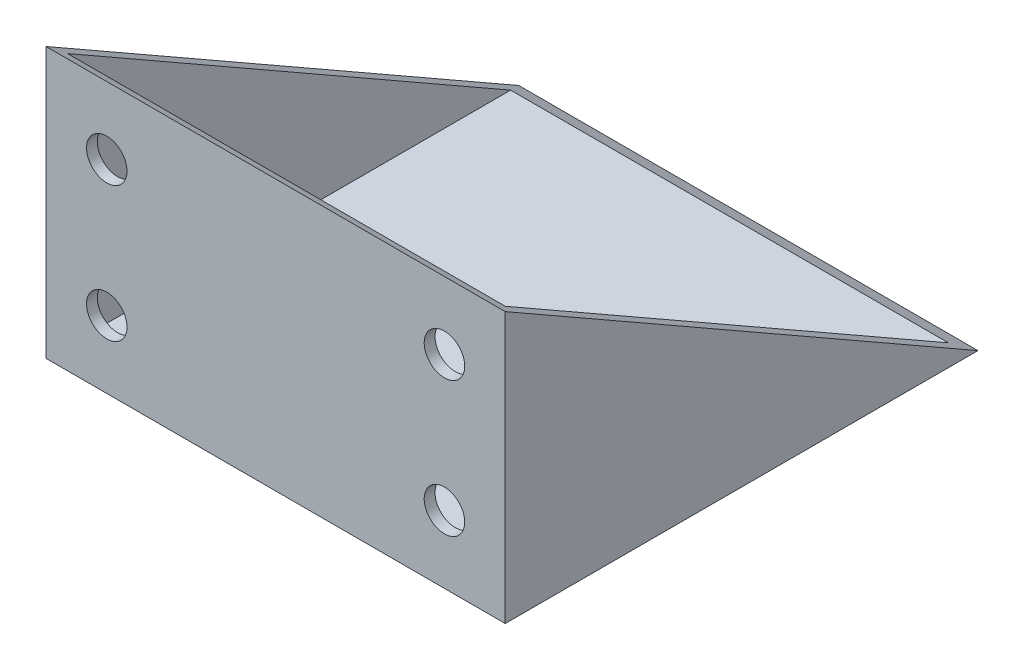
ISO-10303-21;
HEADER;
FILE_DESCRIPTION(('STEP AP214'),'2;1');
FILE_NAME('part.step','',(''),(''),'','','');
FILE_SCHEMA(('AUTOMOTIVE_DESIGN { 1 0 10303 214 1 1 1 1 }'));
ENDSEC;
DATA;
#1=APPLICATION_CONTEXT('core data for automotive mechanical design processes');
#2=APPLICATION_PROTOCOL_DEFINITION('international standard','automotive_design',2000,#1);
#3=PRODUCT_CONTEXT('',#1,'mechanical');
#4=PRODUCT('Part','Part','',(#3));
#5=PRODUCT_RELATED_PRODUCT_CATEGORY('part','',(#4));
#6=PRODUCT_DEFINITION_FORMATION('','',#4);
#7=PRODUCT_DEFINITION_CONTEXT('part definition',#1,'design');
#8=PRODUCT_DEFINITION('design','',#6,#7);
#9=PRODUCT_DEFINITION_SHAPE('','',#8);
#10=(LENGTH_UNIT() NAMED_UNIT(*) SI_UNIT(.MILLI.,.METRE.));
#11=(NAMED_UNIT(*) PLANE_ANGLE_UNIT() SI_UNIT($,.RADIAN.));
#12=(NAMED_UNIT(*) SI_UNIT($,.STERADIAN.) SOLID_ANGLE_UNIT());
#13=UNCERTAINTY_MEASURE_WITH_UNIT(LENGTH_MEASURE(1.E-05),#10,'distance_accuracy_value','');
#14=(GEOMETRIC_REPRESENTATION_CONTEXT(3) GLOBAL_UNCERTAINTY_ASSIGNED_CONTEXT((#13)) GLOBAL_UNIT_ASSIGNED_CONTEXT((#10,
#11,#12)) REPRESENTATION_CONTEXT('',''));
#15=CARTESIAN_POINT('',(0.,0.,0.));
#16=DIRECTION('',(0.,0.,1.));
#17=DIRECTION('',(1.,0.,0.));
#18=AXIS2_PLACEMENT_3D('',#15,#16,#17);
#19=CARTESIAN_POINT('',(34.,0.,-35.));
#20=DIRECTION('',(0.,-0.868243142124459,0.496138938356834));
#21=DIRECTION('',(0.,-0.496138938356834,-0.868243142124459));
#22=AXIS2_PLACEMENT_3D('',#19,#20,#21);
#23=PLANE('',#22);
#24=DIRECTION('',(0.,0.496138938356834,0.868243142124459));
#25=VECTOR('',#24,1.);
#26=CARTESIAN_POINT('',(0.,0.,-35.));
#27=LINE('',#26,#25);
#28=CARTESIAN_POINT('',(0.,0.,-35.));
#29=VERTEX_POINT('',#28);
#30=CARTESIAN_POINT('',(0.,20.,0.));
#31=VERTEX_POINT('',#30);
#32=EDGE_CURVE('E83',#29,#31,#27,.T.);
#33=ORIENTED_EDGE('',*,*,#32,.T.);
#34=DIRECTION('',(-1.,0.,0.));
#35=VECTOR('',#34,1.);
#36=CARTESIAN_POINT('',(34.,20.,0.));
#37=LINE('',#36,#35);
#38=CARTESIAN_POINT('',(34.,20.,0.));
#39=VERTEX_POINT('',#38);
#40=EDGE_CURVE('E158',#39,#31,#37,.T.);
#41=ORIENTED_EDGE('',*,*,#40,.F.);
#42=DIRECTION('',(0.,0.496138938356834,0.868243142124459));
#43=VECTOR('',#42,1.);
#44=CARTESIAN_POINT('',(34.,0.,-35.));
#45=LINE('',#44,#43);
#46=CARTESIAN_POINT('',(34.,0.,-35.));
#47=VERTEX_POINT('',#46);
#48=EDGE_CURVE('E66',#47,#39,#45,.T.);
#49=ORIENTED_EDGE('',*,*,#48,.F.);
#50=DIRECTION('',(-1.,0.,0.));
#51=VECTOR('',#50,1.);
#52=CARTESIAN_POINT('',(34.,0.,-35.));
#53=LINE('',#52,#51);
#54=EDGE_CURVE('E49',#47,#29,#53,.T.);
#55=ORIENTED_EDGE('',*,*,#54,.T.);
#56=EDGE_LOOP('',(#33,#41,#49,#55));
#57=FACE_BOUND('',#56,.T.);
#58=DIRECTION('',(0.,0.496138938356834,0.868243142124459));
#59=VECTOR('',#58,1.);
#60=CARTESIAN_POINT('',(0.800000000000002,0.,-35.));
#61=LINE('',#60,#59);
#62=CARTESIAN_POINT('',(0.8,0.8,-33.6));
#63=VERTEX_POINT('',#62);
#64=CARTESIAN_POINT('',(0.8,19.5428571428571,-0.8));
#65=VERTEX_POINT('',#64);
#66=EDGE_CURVE('E115',#63,#65,#61,.T.);
#67=ORIENTED_EDGE('',*,*,#66,.F.);
#68=DIRECTION('',(-1.,0.,0.));
#69=VECTOR('',#68,1.);
#70=CARTESIAN_POINT('',(34.,0.8,-33.6));
#71=LINE('',#70,#69);
#72=CARTESIAN_POINT('',(33.2,0.8,-33.6));
#73=VERTEX_POINT('',#72);
#74=EDGE_CURVE('E110',#73,#63,#71,.T.);
#75=ORIENTED_EDGE('',*,*,#74,.F.);
#76=DIRECTION('',(0.,0.496138938356834,0.868243142124459));
#77=VECTOR('',#76,1.);
#78=CARTESIAN_POINT('',(33.2,0.,-35.));
#79=LINE('',#78,#77);
#80=CARTESIAN_POINT('',(33.2,19.5428571428571,-0.8));
#81=VERTEX_POINT('',#80);
#82=EDGE_CURVE('E57',#73,#81,#79,.T.);
#83=ORIENTED_EDGE('',*,*,#82,.T.);
#84=DIRECTION('',(-1.,0.,0.));
#85=VECTOR('',#84,1.);
#86=CARTESIAN_POINT('',(34.,19.5428571428571,-0.8));
#87=LINE('',#86,#85);
#88=EDGE_CURVE('E142',#81,#65,#87,.T.);
#89=ORIENTED_EDGE('',*,*,#88,.T.);
#90=EDGE_LOOP('',(#67,#75,#83,#89));
#91=FACE_BOUND('',#90,.T.);
#92=ADVANCED_FACE('F39',(#57,#91),#23,.F.);
#93=CARTESIAN_POINT('',(34.,20.,0.));
#94=DIRECTION('',(0.,0.,-1.));
#95=DIRECTION('',(-1.,0.,0.));
#96=AXIS2_PLACEMENT_3D('',#93,#94,#95);
#97=PLANE('',#96);
#98=CARTESIAN_POINT('',(4.5000000000001,5.,0.));
#99=DIRECTION('',(0.,0.,1.));
#100=DIRECTION('',(1.,0.,0.));
#101=AXIS2_PLACEMENT_3D('',#98,#99,#100);
#102=CIRCLE('',#101,1.5);
#103=CARTESIAN_POINT('',(6.0000000000001,5.,0.));
#104=VERTEX_POINT('',#103);
#105=EDGE_CURVE('E203',#104,#104,#102,.T.);
#106=ORIENTED_EDGE('',*,*,#105,.F.);
#107=EDGE_LOOP('',(#106));
#108=FACE_BOUND('',#107,.T.);
#109=CARTESIAN_POINT('',(29.5,15.,0.));
#110=DIRECTION('',(0.,0.,1.));
#111=DIRECTION('',(1.,0.,0.));
#112=AXIS2_PLACEMENT_3D('',#109,#110,#111);
#113=CIRCLE('',#112,1.5);
#114=CARTESIAN_POINT('',(31.,15.,0.));
#115=VERTEX_POINT('',#114);
#116=EDGE_CURVE('E206',#115,#115,#113,.T.);
#117=ORIENTED_EDGE('',*,*,#116,.F.);
#118=EDGE_LOOP('',(#117));
#119=FACE_BOUND('',#118,.T.);
#120=CARTESIAN_POINT('',(29.5000000000001,5.,0.));
#121=DIRECTION('',(0.,0.,1.));
#122=DIRECTION('',(1.,0.,0.));
#123=AXIS2_PLACEMENT_3D('',#120,#121,#122);
#124=CIRCLE('',#123,1.5);
#125=CARTESIAN_POINT('',(31.0000000000001,5.,0.));
#126=VERTEX_POINT('',#125);
#127=EDGE_CURVE('E212',#126,#126,#124,.T.);
#128=ORIENTED_EDGE('',*,*,#127,.F.);
#129=EDGE_LOOP('',(#128));
#130=FACE_BOUND('',#129,.T.);
#131=CARTESIAN_POINT('',(4.49999999999999,15.,0.));
#132=DIRECTION('',(0.,0.,1.));
#133=DIRECTION('',(1.,0.,0.));
#134=AXIS2_PLACEMENT_3D('',#131,#132,#133);
#135=CIRCLE('',#134,1.5);
#136=CARTESIAN_POINT('',(5.99999999999999,15.,0.));
#137=VERTEX_POINT('',#136);
#138=EDGE_CURVE('E134',#137,#137,#135,.T.);
#139=ORIENTED_EDGE('',*,*,#138,.F.);
#140=EDGE_LOOP('',(#139));
#141=FACE_BOUND('',#140,.T.);
#142=DIRECTION('',(0.,-1.,0.));
#143=VECTOR('',#142,1.);
#144=CARTESIAN_POINT('',(0.,20.,0.));
#145=LINE('',#144,#143);
#146=CARTESIAN_POINT('',(0.,0.,0.));
#147=VERTEX_POINT('',#146);
#148=EDGE_CURVE('E125',#31,#147,#145,.T.);
#149=ORIENTED_EDGE('',*,*,#148,.T.);
#150=DIRECTION('',(-1.,0.,0.));
#151=VECTOR('',#150,1.);
#152=CARTESIAN_POINT('',(34.,0.,0.));
#153=LINE('',#152,#151);
#154=CARTESIAN_POINT('',(34.,0.,0.));
#155=VERTEX_POINT('',#154);
#156=EDGE_CURVE('E11',#155,#147,#153,.T.);
#157=ORIENTED_EDGE('',*,*,#156,.F.);
#158=DIRECTION('',(0.,-1.,0.));
#159=VECTOR('',#158,1.);
#160=CARTESIAN_POINT('',(34.,20.,0.));
#161=LINE('',#160,#159);
#162=EDGE_CURVE('E151',#39,#155,#161,.T.);
#163=ORIENTED_EDGE('',*,*,#162,.F.);
#164=ORIENTED_EDGE('',*,*,#40,.T.);
#165=EDGE_LOOP('',(#149,#157,#163,#164));
#166=FACE_BOUND('',#165,.T.);
#167=ADVANCED_FACE('F41',(#108,#119,#130,#141,#166),#97,.F.);
#168=CARTESIAN_POINT('',(34.,0.,0.));
#169=DIRECTION('',(0.,1.,0.));
#170=DIRECTION('',(0.,0.,1.));
#171=AXIS2_PLACEMENT_3D('',#168,#169,#170);
#172=PLANE('',#171);
#173=DIRECTION('',(0.,0.,-1.));
#174=VECTOR('',#173,1.);
#175=CARTESIAN_POINT('',(0.,0.,0.));
#176=LINE('',#175,#174);
#177=EDGE_CURVE('E162',#147,#29,#176,.T.);
#178=ORIENTED_EDGE('',*,*,#177,.T.);
#179=ORIENTED_EDGE('',*,*,#54,.F.);
#180=DIRECTION('',(0.,0.,-1.));
#181=VECTOR('',#180,1.);
#182=CARTESIAN_POINT('',(34.,0.,0.));
#183=LINE('',#182,#181);
#184=EDGE_CURVE('E88',#155,#47,#183,.T.);
#185=ORIENTED_EDGE('',*,*,#184,.F.);
#186=ORIENTED_EDGE('',*,*,#156,.T.);
#187=EDGE_LOOP('',(#178,#179,#185,#186));
#188=FACE_BOUND('',#187,.T.);
#189=ADVANCED_FACE('F220',(#188),#172,.F.);
#190=CARTESIAN_POINT('',(34.,0.,0.));
#191=DIRECTION('',(1.,0.,0.));
#192=DIRECTION('',(0.,0.,-1.));
#193=AXIS2_PLACEMENT_3D('',#190,#191,#192);
#194=PLANE('',#193);
#195=ORIENTED_EDGE('',*,*,#162,.T.);
#196=ORIENTED_EDGE('',*,*,#184,.T.);
#197=ORIENTED_EDGE('',*,*,#48,.T.);
#198=EDGE_LOOP('',(#195,#196,#197));
#199=FACE_BOUND('',#198,.T.);
#200=ADVANCED_FACE('F228',(#199),#194,.T.);
#201=CARTESIAN_POINT('',(0.,0.,0.));
#202=DIRECTION('',(1.,0.,0.));
#203=DIRECTION('',(0.,0.,-1.));
#204=AXIS2_PLACEMENT_3D('',#201,#202,#203);
#205=PLANE('',#204);
#206=ORIENTED_EDGE('',*,*,#148,.F.);
#207=ORIENTED_EDGE('',*,*,#32,.F.);
#208=ORIENTED_EDGE('',*,*,#177,.F.);
#209=EDGE_LOOP('',(#206,#207,#208));
#210=FACE_BOUND('',#209,.T.);
#211=ADVANCED_FACE('F187',(#210),#205,.F.);
#212=CARTESIAN_POINT('',(34.,20.,-0.8));
#213=DIRECTION('',(0.,0.,-1.));
#214=DIRECTION('',(-1.,0.,0.));
#215=AXIS2_PLACEMENT_3D('',#212,#213,#214);
#216=PLANE('',#215);
#217=CARTESIAN_POINT('',(4.5000000000001,5.,-0.8));
#218=DIRECTION('',(0.,0.,-1.));
#219=DIRECTION('',(-1.,0.,0.));
#220=AXIS2_PLACEMENT_3D('',#217,#218,#219);
#221=CIRCLE('',#220,1.5);
#222=CARTESIAN_POINT('',(3.0000000000001,5.,-0.8));
#223=VERTEX_POINT('',#222);
#224=EDGE_CURVE('E43',#223,#223,#221,.T.);
#225=ORIENTED_EDGE('',*,*,#224,.F.);
#226=EDGE_LOOP('',(#225));
#227=FACE_BOUND('',#226,.T.);
#228=CARTESIAN_POINT('',(29.5,15.,-0.8));
#229=DIRECTION('',(0.,0.,-1.));
#230=DIRECTION('',(-1.,0.,0.));
#231=AXIS2_PLACEMENT_3D('',#228,#229,#230);
#232=CIRCLE('',#231,1.5);
#233=CARTESIAN_POINT('',(28.,15.,-0.8));
#234=VERTEX_POINT('',#233);
#235=EDGE_CURVE('E132',#234,#234,#232,.T.);
#236=ORIENTED_EDGE('',*,*,#235,.F.);
#237=EDGE_LOOP('',(#236));
#238=FACE_BOUND('',#237,.T.);
#239=CARTESIAN_POINT('',(29.5000000000001,5.,-0.8));
#240=DIRECTION('',(0.,0.,-1.));
#241=DIRECTION('',(-1.,0.,0.));
#242=AXIS2_PLACEMENT_3D('',#239,#240,#241);
#243=CIRCLE('',#242,1.5);
#244=CARTESIAN_POINT('',(28.0000000000001,5.,-0.8));
#245=VERTEX_POINT('',#244);
#246=EDGE_CURVE('E175',#245,#245,#243,.T.);
#247=ORIENTED_EDGE('',*,*,#246,.F.);
#248=EDGE_LOOP('',(#247));
#249=FACE_BOUND('',#248,.T.);
#250=CARTESIAN_POINT('',(4.49999999999999,15.,-0.8));
#251=DIRECTION('',(0.,0.,-1.));
#252=DIRECTION('',(-1.,0.,0.));
#253=AXIS2_PLACEMENT_3D('',#250,#251,#252);
#254=CIRCLE('',#253,1.5);
#255=CARTESIAN_POINT('',(2.99999999999999,15.,-0.8));
#256=VERTEX_POINT('',#255);
#257=EDGE_CURVE('E171',#256,#256,#254,.T.);
#258=ORIENTED_EDGE('',*,*,#257,.F.);
#259=EDGE_LOOP('',(#258));
#260=FACE_BOUND('',#259,.T.);
#261=DIRECTION('',(0.,-1.,0.));
#262=VECTOR('',#261,1.);
#263=CARTESIAN_POINT('',(0.800000000000002,20.,-0.8));
#264=LINE('',#263,#262);
#265=CARTESIAN_POINT('',(0.8,0.8,-0.8));
#266=VERTEX_POINT('',#265);
#267=EDGE_CURVE('E116',#65,#266,#264,.T.);
#268=ORIENTED_EDGE('',*,*,#267,.F.);
#269=ORIENTED_EDGE('',*,*,#88,.F.);
#270=DIRECTION('',(0.,-1.,0.));
#271=VECTOR('',#270,1.);
#272=CARTESIAN_POINT('',(33.2,20.,-0.8));
#273=LINE('',#272,#271);
#274=CARTESIAN_POINT('',(33.2,0.8,-0.8));
#275=VERTEX_POINT('',#274);
#276=EDGE_CURVE('E123',#81,#275,#273,.T.);
#277=ORIENTED_EDGE('',*,*,#276,.T.);
#278=DIRECTION('',(-1.,0.,0.));
#279=VECTOR('',#278,1.);
#280=CARTESIAN_POINT('',(34.,0.8,-0.8));
#281=LINE('',#280,#279);
#282=EDGE_CURVE('E108',#275,#266,#281,.T.);
#283=ORIENTED_EDGE('',*,*,#282,.T.);
#284=EDGE_LOOP('',(#268,#269,#277,#283));
#285=FACE_BOUND('',#284,.T.);
#286=ADVANCED_FACE('F121',(#227,#238,#249,#260,#285),#216,.T.);
#287=CARTESIAN_POINT('',(34.,0.8,0.));
#288=DIRECTION('',(0.,1.,0.));
#289=DIRECTION('',(0.,0.,1.));
#290=AXIS2_PLACEMENT_3D('',#287,#288,#289);
#291=PLANE('',#290);
#292=DIRECTION('',(0.,0.,-1.));
#293=VECTOR('',#292,1.);
#294=CARTESIAN_POINT('',(0.800000000000002,0.8,0.));
#295=LINE('',#294,#293);
#296=EDGE_CURVE('E105',#266,#63,#295,.T.);
#297=ORIENTED_EDGE('',*,*,#296,.F.);
#298=ORIENTED_EDGE('',*,*,#282,.F.);
#299=DIRECTION('',(0.,0.,-1.));
#300=VECTOR('',#299,1.);
#301=CARTESIAN_POINT('',(33.2,0.8,0.));
#302=LINE('',#301,#300);
#303=EDGE_CURVE('E138',#275,#73,#302,.T.);
#304=ORIENTED_EDGE('',*,*,#303,.T.);
#305=ORIENTED_EDGE('',*,*,#74,.T.);
#306=EDGE_LOOP('',(#297,#298,#304,#305));
#307=FACE_BOUND('',#306,.T.);
#308=ADVANCED_FACE('F107',(#307),#291,.T.);
#309=CARTESIAN_POINT('',(33.2,0.,0.));
#310=DIRECTION('',(1.,0.,0.));
#311=DIRECTION('',(0.,0.,-1.));
#312=AXIS2_PLACEMENT_3D('',#309,#310,#311);
#313=PLANE('',#312);
#314=ORIENTED_EDGE('',*,*,#276,.F.);
#315=ORIENTED_EDGE('',*,*,#82,.F.);
#316=ORIENTED_EDGE('',*,*,#303,.F.);
#317=EDGE_LOOP('',(#314,#315,#316));
#318=FACE_BOUND('',#317,.T.);
#319=ADVANCED_FACE('F243',(#318),#313,.F.);
#320=CARTESIAN_POINT('',(0.8,0.,0.));
#321=DIRECTION('',(1.,0.,0.));
#322=DIRECTION('',(0.,0.,-1.));
#323=AXIS2_PLACEMENT_3D('',#320,#321,#322);
#324=PLANE('',#323);
#325=ORIENTED_EDGE('',*,*,#267,.T.);
#326=ORIENTED_EDGE('',*,*,#296,.T.);
#327=ORIENTED_EDGE('',*,*,#66,.T.);
#328=EDGE_LOOP('',(#325,#326,#327));
#329=FACE_BOUND('',#328,.T.);
#330=ADVANCED_FACE('F127',(#329),#324,.T.);
#331=CARTESIAN_POINT('',(4.49999999999999,15.,-3.));
#332=DIRECTION('',(0.,0.,1.));
#333=DIRECTION('',(1.,0.,0.));
#334=AXIS2_PLACEMENT_3D('',#331,#332,#333);
#335=CYLINDRICAL_SURFACE('',#334,1.5);
#336=ORIENTED_EDGE('',*,*,#257,.T.);
#337=EDGE_LOOP('',(#336));
#338=FACE_BOUND('',#337,.T.);
#339=ORIENTED_EDGE('',*,*,#138,.T.);
#340=EDGE_LOOP('',(#339));
#341=FACE_BOUND('',#340,.T.);
#342=ADVANCED_FACE('F194',(#338,#341),#335,.F.);
#343=CARTESIAN_POINT('',(29.5000000000001,5.,-3.));
#344=DIRECTION('',(0.,0.,1.));
#345=DIRECTION('',(1.,0.,0.));
#346=AXIS2_PLACEMENT_3D('',#343,#344,#345);
#347=CYLINDRICAL_SURFACE('',#346,1.5);
#348=ORIENTED_EDGE('',*,*,#246,.T.);
#349=EDGE_LOOP('',(#348));
#350=FACE_BOUND('',#349,.T.);
#351=ORIENTED_EDGE('',*,*,#127,.T.);
#352=EDGE_LOOP('',(#351));
#353=FACE_BOUND('',#352,.T.);
#354=ADVANCED_FACE('F197',(#350,#353),#347,.F.);
#355=CARTESIAN_POINT('',(29.5,15.,-3.));
#356=DIRECTION('',(0.,0.,1.));
#357=DIRECTION('',(1.,0.,0.));
#358=AXIS2_PLACEMENT_3D('',#355,#356,#357);
#359=CYLINDRICAL_SURFACE('',#358,1.5);
#360=ORIENTED_EDGE('',*,*,#235,.T.);
#361=EDGE_LOOP('',(#360));
#362=FACE_BOUND('',#361,.T.);
#363=ORIENTED_EDGE('',*,*,#116,.T.);
#364=EDGE_LOOP('',(#363));
#365=FACE_BOUND('',#364,.T.);
#366=ADVANCED_FACE('F182',(#362,#365),#359,.F.);
#367=CARTESIAN_POINT('',(4.5000000000001,5.,-3.));
#368=DIRECTION('',(0.,0.,1.));
#369=DIRECTION('',(1.,0.,0.));
#370=AXIS2_PLACEMENT_3D('',#367,#368,#369);
#371=CYLINDRICAL_SURFACE('',#370,1.5);
#372=ORIENTED_EDGE('',*,*,#224,.T.);
#373=EDGE_LOOP('',(#372));
#374=FACE_BOUND('',#373,.T.);
#375=ORIENTED_EDGE('',*,*,#105,.T.);
#376=EDGE_LOOP('',(#375));
#377=FACE_BOUND('',#376,.T.);
#378=ADVANCED_FACE('F250',(#374,#377),#371,.F.);
#379=CLOSED_SHELL('',(#92,#167,#189,#200,#211,#286,#308,#319,#330,#342,#354,#366,#378));
#380=MANIFOLD_SOLID_BREP('B2',#379);
#381=ADVANCED_BREP_SHAPE_REPRESENTATION('',(#18,#380),#14);
#382=SHAPE_DEFINITION_REPRESENTATION(#9,#381);
ENDSEC;
END-ISO-10303-21;
